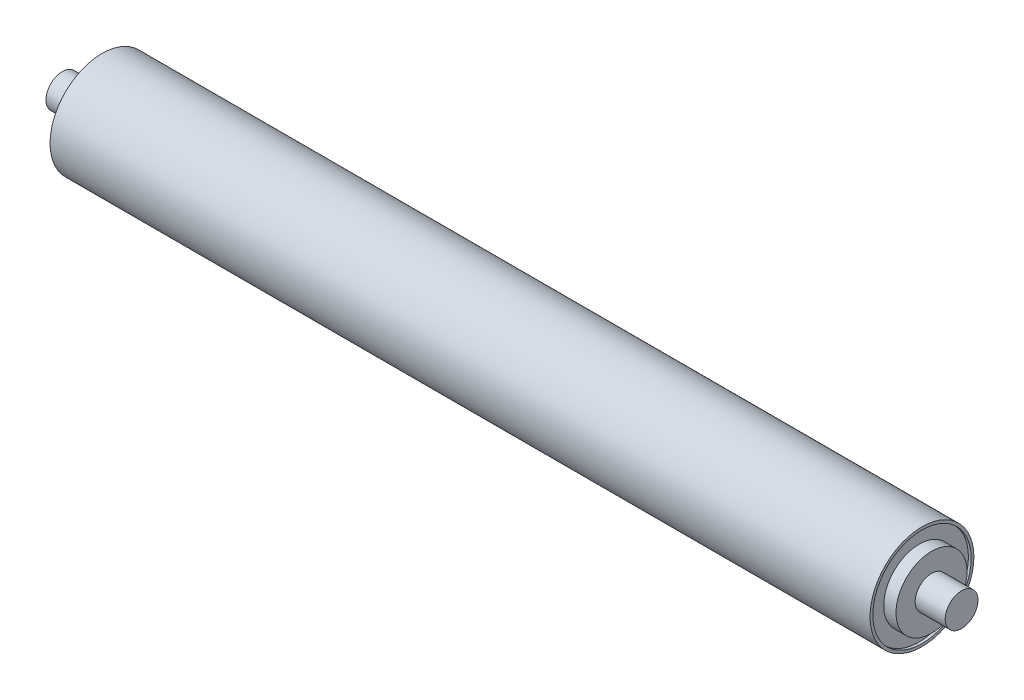
ISO-10303-21;
HEADER;
FILE_DESCRIPTION(('STEP AP214'),'2;1');
FILE_NAME('part.step','',(''),(''),'','','');
FILE_SCHEMA(('AUTOMOTIVE_DESIGN { 1 0 10303 214 1 1 1 1 }'));
ENDSEC;
DATA;
#1=APPLICATION_CONTEXT('core data for automotive mechanical design processes');
#2=APPLICATION_PROTOCOL_DEFINITION('international standard','automotive_design',2000,#1);
#3=PRODUCT_CONTEXT('',#1,'mechanical');
#4=PRODUCT('Part','Part','',(#3));
#5=PRODUCT_RELATED_PRODUCT_CATEGORY('part','',(#4));
#6=PRODUCT_DEFINITION_FORMATION('','',#4);
#7=PRODUCT_DEFINITION_CONTEXT('part definition',#1,'design');
#8=PRODUCT_DEFINITION('design','',#6,#7);
#9=PRODUCT_DEFINITION_SHAPE('','',#8);
#10=(LENGTH_UNIT() NAMED_UNIT(*) SI_UNIT(.MILLI.,.METRE.));
#11=(NAMED_UNIT(*) PLANE_ANGLE_UNIT() SI_UNIT($,.RADIAN.));
#12=(NAMED_UNIT(*) SI_UNIT($,.STERADIAN.) SOLID_ANGLE_UNIT());
#13=UNCERTAINTY_MEASURE_WITH_UNIT(LENGTH_MEASURE(1.E-05),#10,'distance_accuracy_value','');
#14=(GEOMETRIC_REPRESENTATION_CONTEXT(3) GLOBAL_UNCERTAINTY_ASSIGNED_CONTEXT((#13)) GLOBAL_UNIT_ASSIGNED_CONTEXT((#10,
#11,#12)) REPRESENTATION_CONTEXT('',''));
#15=CARTESIAN_POINT('',(0.,0.,0.));
#16=DIRECTION('',(0.,0.,1.));
#17=DIRECTION('',(1.,0.,0.));
#18=AXIS2_PLACEMENT_3D('',#15,#16,#17);
#19=CARTESIAN_POINT('',(0.,0.,0.));
#20=DIRECTION('',(-1.,0.,0.));
#21=DIRECTION('',(0.,0.,1.));
#22=AXIS2_PLACEMENT_3D('',#19,#20,#21);
#23=PLANE('',#22);
#24=CARTESIAN_POINT('',(0.,0.,0.));
#25=DIRECTION('',(1.,0.,0.));
#26=DIRECTION('',(0.,0.,-1.));
#27=AXIS2_PLACEMENT_3D('',#24,#25,#26);
#28=CIRCLE('',#27,6.);
#29=CARTESIAN_POINT('',(0.,0.,-6.));
#30=VERTEX_POINT('',#29);
#31=EDGE_CURVE('E10',#30,#30,#28,.T.);
#32=ORIENTED_EDGE('',*,*,#31,.F.);
#33=EDGE_LOOP('',(#32));
#34=FACE_BOUND('',#33,.T.);
#35=ADVANCED_FACE('F33',(#34),#23,.T.);
#36=CARTESIAN_POINT('',(329.,0.,0.));
#37=DIRECTION('',(1.,0.,0.));
#38=DIRECTION('',(0.,0.,-1.));
#39=AXIS2_PLACEMENT_3D('',#36,#37,#38);
#40=CYLINDRICAL_SURFACE('',#39,6.);
#41=ORIENTED_EDGE('',*,*,#31,.T.);
#42=EDGE_LOOP('',(#41));
#43=FACE_BOUND('',#42,.T.);
#44=CARTESIAN_POINT('',(11.,0.,0.));
#45=DIRECTION('',(1.,0.,0.));
#46=DIRECTION('',(0.,0.,-1.));
#47=AXIS2_PLACEMENT_3D('',#44,#45,#46);
#48=CIRCLE('',#47,6.);
#49=CARTESIAN_POINT('',(11.,0.,-6.));
#50=VERTEX_POINT('',#49);
#51=EDGE_CURVE('E39',#50,#50,#48,.T.);
#52=ORIENTED_EDGE('',*,*,#51,.F.);
#53=EDGE_LOOP('',(#52));
#54=FACE_BOUND('',#53,.T.);
#55=ADVANCED_FACE('F99',(#43,#54),#40,.T.);
#56=CARTESIAN_POINT('',(11.,6.,0.));
#57=DIRECTION('',(-1.,0.,0.));
#58=DIRECTION('',(0.,0.,1.));
#59=AXIS2_PLACEMENT_3D('',#56,#57,#58);
#60=PLANE('',#59);
#61=ORIENTED_EDGE('',*,*,#51,.T.);
#62=EDGE_LOOP('',(#61));
#63=FACE_BOUND('',#62,.T.);
#64=CARTESIAN_POINT('',(11.,0.,0.));
#65=DIRECTION('',(1.,0.,0.));
#66=DIRECTION('',(0.,0.,-1.));
#67=AXIS2_PLACEMENT_3D('',#64,#65,#66);
#68=CIRCLE('',#67,13.);
#69=CARTESIAN_POINT('',(11.,0.,-13.));
#70=VERTEX_POINT('',#69);
#71=EDGE_CURVE('E43',#70,#70,#68,.T.);
#72=ORIENTED_EDGE('',*,*,#71,.F.);
#73=EDGE_LOOP('',(#72));
#74=FACE_BOUND('',#73,.T.);
#75=ADVANCED_FACE('F104',(#63,#74),#60,.T.);
#76=CARTESIAN_POINT('',(329.,0.,0.));
#77=DIRECTION('',(1.,0.,0.));
#78=DIRECTION('',(0.,0.,-1.));
#79=AXIS2_PLACEMENT_3D('',#76,#77,#78);
#80=CYLINDRICAL_SURFACE('',#79,13.);
#81=ORIENTED_EDGE('',*,*,#71,.T.);
#82=EDGE_LOOP('',(#81));
#83=FACE_BOUND('',#82,.T.);
#84=CARTESIAN_POINT('',(15.5,0.,0.));
#85=DIRECTION('',(1.,0.,0.));
#86=DIRECTION('',(0.,0.,-1.));
#87=AXIS2_PLACEMENT_3D('',#84,#85,#86);
#88=CIRCLE('',#87,13.);
#89=CARTESIAN_POINT('',(15.5,0.,-13.));
#90=VERTEX_POINT('',#89);
#91=EDGE_CURVE('E47',#90,#90,#88,.T.);
#92=ORIENTED_EDGE('',*,*,#91,.F.);
#93=EDGE_LOOP('',(#92));
#94=FACE_BOUND('',#93,.T.);
#95=ADVANCED_FACE('F108',(#83,#94),#80,.T.);
#96=CARTESIAN_POINT('',(15.5,13.,0.));
#97=DIRECTION('',(-1.,0.,0.));
#98=DIRECTION('',(0.,0.,1.));
#99=AXIS2_PLACEMENT_3D('',#96,#97,#98);
#100=PLANE('',#99);
#101=ORIENTED_EDGE('',*,*,#91,.T.);
#102=EDGE_LOOP('',(#101));
#103=FACE_BOUND('',#102,.T.);
#104=CARTESIAN_POINT('',(15.5,0.,0.));
#105=DIRECTION('',(1.,0.,0.));
#106=DIRECTION('',(0.,0.,-1.));
#107=AXIS2_PLACEMENT_3D('',#104,#105,#106);
#108=CIRCLE('',#107,18.);
#109=CARTESIAN_POINT('',(15.5,0.,-18.));
#110=VERTEX_POINT('',#109);
#111=EDGE_CURVE('E52',#110,#110,#108,.T.);
#112=ORIENTED_EDGE('',*,*,#111,.F.);
#113=EDGE_LOOP('',(#112));
#114=FACE_BOUND('',#113,.T.);
#115=ADVANCED_FACE('F114',(#103,#114),#100,.T.);
#116=CARTESIAN_POINT('',(329.,0.,0.));
#117=DIRECTION('',(1.,0.,0.));
#118=DIRECTION('',(0.,0.,-1.));
#119=AXIS2_PLACEMENT_3D('',#116,#117,#118);
#120=CYLINDRICAL_SURFACE('',#119,18.);
#121=ORIENTED_EDGE('',*,*,#111,.T.);
#122=EDGE_LOOP('',(#121));
#123=FACE_BOUND('',#122,.T.);
#124=CARTESIAN_POINT('',(14.5,0.,0.));
#125=DIRECTION('',(1.,0.,0.));
#126=DIRECTION('',(0.,0.,-1.));
#127=AXIS2_PLACEMENT_3D('',#124,#125,#126);
#128=CIRCLE('',#127,18.);
#129=CARTESIAN_POINT('',(14.5,0.,-18.));
#130=VERTEX_POINT('',#129);
#131=EDGE_CURVE('E55',#130,#130,#128,.T.);
#132=ORIENTED_EDGE('',*,*,#131,.F.);
#133=EDGE_LOOP('',(#132));
#134=FACE_BOUND('',#133,.T.);
#135=ADVANCED_FACE('F118',(#123,#134),#120,.F.);
#136=CARTESIAN_POINT('',(14.5,18.,0.));
#137=DIRECTION('',(-1.,0.,0.));
#138=DIRECTION('',(0.,0.,1.));
#139=AXIS2_PLACEMENT_3D('',#136,#137,#138);
#140=PLANE('',#139);
#141=ORIENTED_EDGE('',*,*,#131,.T.);
#142=EDGE_LOOP('',(#141));
#143=FACE_BOUND('',#142,.T.);
#144=CARTESIAN_POINT('',(14.5,0.,0.));
#145=DIRECTION('',(1.,0.,0.));
#146=DIRECTION('',(0.,0.,-1.));
#147=AXIS2_PLACEMENT_3D('',#144,#145,#146);
#148=CIRCLE('',#147,19.);
#149=CARTESIAN_POINT('',(14.5,0.,-19.));
#150=VERTEX_POINT('',#149);
#151=EDGE_CURVE('E58',#150,#150,#148,.T.);
#152=ORIENTED_EDGE('',*,*,#151,.F.);
#153=EDGE_LOOP('',(#152));
#154=FACE_BOUND('',#153,.T.);
#155=ADVANCED_FACE('F122',(#143,#154),#140,.T.);
#156=CARTESIAN_POINT('',(329.,0.,0.));
#157=DIRECTION('',(1.,0.,0.));
#158=DIRECTION('',(0.,0.,-1.));
#159=AXIS2_PLACEMENT_3D('',#156,#157,#158);
#160=CYLINDRICAL_SURFACE('',#159,19.);
#161=ORIENTED_EDGE('',*,*,#151,.T.);
#162=EDGE_LOOP('',(#161));
#163=FACE_BOUND('',#162,.T.);
#164=CARTESIAN_POINT('',(314.5,0.,0.));
#165=DIRECTION('',(1.,0.,0.));
#166=DIRECTION('',(0.,0.,-1.));
#167=AXIS2_PLACEMENT_3D('',#164,#165,#166);
#168=CIRCLE('',#167,19.);
#169=CARTESIAN_POINT('',(314.5,0.,-19.));
#170=VERTEX_POINT('',#169);
#171=EDGE_CURVE('E61',#170,#170,#168,.T.);
#172=ORIENTED_EDGE('',*,*,#171,.F.);
#173=EDGE_LOOP('',(#172));
#174=FACE_BOUND('',#173,.T.);
#175=ADVANCED_FACE('F126',(#163,#174),#160,.T.);
#176=CARTESIAN_POINT('',(314.5,18.,0.));
#177=DIRECTION('',(1.,0.,0.));
#178=DIRECTION('',(0.,0.,-1.));
#179=AXIS2_PLACEMENT_3D('',#176,#177,#178);
#180=PLANE('',#179);
#181=ORIENTED_EDGE('',*,*,#171,.T.);
#182=EDGE_LOOP('',(#181));
#183=FACE_BOUND('',#182,.T.);
#184=CARTESIAN_POINT('',(314.5,0.,0.));
#185=DIRECTION('',(1.,0.,0.));
#186=DIRECTION('',(0.,0.,-1.));
#187=AXIS2_PLACEMENT_3D('',#184,#185,#186);
#188=CIRCLE('',#187,18.);
#189=CARTESIAN_POINT('',(314.5,0.,-18.));
#190=VERTEX_POINT('',#189);
#191=EDGE_CURVE('E64',#190,#190,#188,.T.);
#192=ORIENTED_EDGE('',*,*,#191,.F.);
#193=EDGE_LOOP('',(#192));
#194=FACE_BOUND('',#193,.T.);
#195=ADVANCED_FACE('F130',(#183,#194),#180,.T.);
#196=CARTESIAN_POINT('',(329.,0.,0.));
#197=DIRECTION('',(1.,0.,0.));
#198=DIRECTION('',(0.,0.,-1.));
#199=AXIS2_PLACEMENT_3D('',#196,#197,#198);
#200=CYLINDRICAL_SURFACE('',#199,18.);
#201=ORIENTED_EDGE('',*,*,#191,.T.);
#202=EDGE_LOOP('',(#201));
#203=FACE_BOUND('',#202,.T.);
#204=CARTESIAN_POINT('',(313.5,0.,0.));
#205=DIRECTION('',(1.,0.,0.));
#206=DIRECTION('',(0.,0.,-1.));
#207=AXIS2_PLACEMENT_3D('',#204,#205,#206);
#208=CIRCLE('',#207,18.);
#209=CARTESIAN_POINT('',(313.5,0.,-18.));
#210=VERTEX_POINT('',#209);
#211=EDGE_CURVE('E67',#210,#210,#208,.T.);
#212=ORIENTED_EDGE('',*,*,#211,.F.);
#213=EDGE_LOOP('',(#212));
#214=FACE_BOUND('',#213,.T.);
#215=ADVANCED_FACE('F134',(#203,#214),#200,.F.);
#216=CARTESIAN_POINT('',(313.5,13.,0.));
#217=DIRECTION('',(1.,0.,0.));
#218=DIRECTION('',(0.,0.,-1.));
#219=AXIS2_PLACEMENT_3D('',#216,#217,#218);
#220=PLANE('',#219);
#221=ORIENTED_EDGE('',*,*,#211,.T.);
#222=EDGE_LOOP('',(#221));
#223=FACE_BOUND('',#222,.T.);
#224=CARTESIAN_POINT('',(313.5,0.,0.));
#225=DIRECTION('',(1.,0.,0.));
#226=DIRECTION('',(0.,0.,-1.));
#227=AXIS2_PLACEMENT_3D('',#224,#225,#226);
#228=CIRCLE('',#227,13.);
#229=CARTESIAN_POINT('',(313.5,0.,-13.));
#230=VERTEX_POINT('',#229);
#231=EDGE_CURVE('E70',#230,#230,#228,.T.);
#232=ORIENTED_EDGE('',*,*,#231,.F.);
#233=EDGE_LOOP('',(#232));
#234=FACE_BOUND('',#233,.T.);
#235=ADVANCED_FACE('F138',(#223,#234),#220,.T.);
#236=CARTESIAN_POINT('',(329.,0.,0.));
#237=DIRECTION('',(1.,0.,0.));
#238=DIRECTION('',(0.,0.,-1.));
#239=AXIS2_PLACEMENT_3D('',#236,#237,#238);
#240=CYLINDRICAL_SURFACE('',#239,13.);
#241=ORIENTED_EDGE('',*,*,#231,.T.);
#242=EDGE_LOOP('',(#241));
#243=FACE_BOUND('',#242,.T.);
#244=CARTESIAN_POINT('',(318.,0.,0.));
#245=DIRECTION('',(1.,0.,0.));
#246=DIRECTION('',(0.,0.,-1.));
#247=AXIS2_PLACEMENT_3D('',#244,#245,#246);
#248=CIRCLE('',#247,13.);
#249=CARTESIAN_POINT('',(318.,0.,-13.));
#250=VERTEX_POINT('',#249);
#251=EDGE_CURVE('E73',#250,#250,#248,.T.);
#252=ORIENTED_EDGE('',*,*,#251,.F.);
#253=EDGE_LOOP('',(#252));
#254=FACE_BOUND('',#253,.T.);
#255=ADVANCED_FACE('F95',(#243,#254),#240,.T.);
#256=CARTESIAN_POINT('',(318.,6.,0.));
#257=DIRECTION('',(1.,0.,0.));
#258=DIRECTION('',(0.,0.,-1.));
#259=AXIS2_PLACEMENT_3D('',#256,#257,#258);
#260=PLANE('',#259);
#261=ORIENTED_EDGE('',*,*,#251,.T.);
#262=EDGE_LOOP('',(#261));
#263=FACE_BOUND('',#262,.T.);
#264=CARTESIAN_POINT('',(318.,0.,0.));
#265=DIRECTION('',(1.,0.,0.));
#266=DIRECTION('',(0.,0.,-1.));
#267=AXIS2_PLACEMENT_3D('',#264,#265,#266);
#268=CIRCLE('',#267,6.);
#269=CARTESIAN_POINT('',(318.,0.,-6.));
#270=VERTEX_POINT('',#269);
#271=EDGE_CURVE('E76',#270,#270,#268,.T.);
#272=ORIENTED_EDGE('',*,*,#271,.F.);
#273=EDGE_LOOP('',(#272));
#274=FACE_BOUND('',#273,.T.);
#275=ADVANCED_FACE('F87',(#263,#274),#260,.T.);
#276=CARTESIAN_POINT('',(329.,0.,0.));
#277=DIRECTION('',(1.,0.,0.));
#278=DIRECTION('',(0.,0.,-1.));
#279=AXIS2_PLACEMENT_3D('',#276,#277,#278);
#280=CYLINDRICAL_SURFACE('',#279,6.);
#281=ORIENTED_EDGE('',*,*,#271,.T.);
#282=EDGE_LOOP('',(#281));
#283=FACE_BOUND('',#282,.T.);
#284=CARTESIAN_POINT('',(329.,0.,0.));
#285=DIRECTION('',(1.,0.,0.));
#286=DIRECTION('',(0.,0.,-1.));
#287=AXIS2_PLACEMENT_3D('',#284,#285,#286);
#288=CIRCLE('',#287,6.);
#289=CARTESIAN_POINT('',(329.,0.,-6.));
#290=VERTEX_POINT('',#289);
#291=EDGE_CURVE('E79',#290,#290,#288,.T.);
#292=ORIENTED_EDGE('',*,*,#291,.F.);
#293=EDGE_LOOP('',(#292));
#294=FACE_BOUND('',#293,.T.);
#295=ADVANCED_FACE('F85',(#283,#294),#280,.T.);
#296=CARTESIAN_POINT('',(329.,0.,0.));
#297=DIRECTION('',(1.,0.,0.));
#298=DIRECTION('',(0.,0.,-1.));
#299=AXIS2_PLACEMENT_3D('',#296,#297,#298);
#300=PLANE('',#299);
#301=ORIENTED_EDGE('',*,*,#291,.T.);
#302=EDGE_LOOP('',(#301));
#303=FACE_BOUND('',#302,.T.);
#304=ADVANCED_FACE('F83',(#303),#300,.T.);
#305=CLOSED_SHELL('',(#35,#55,#75,#95,#115,#135,#155,#175,#195,#215,#235,#255,#275,#295,#304));
#306=MANIFOLD_SOLID_BREP('B2',#305);
#307=ADVANCED_BREP_SHAPE_REPRESENTATION('',(#18,#306),#14);
#308=SHAPE_DEFINITION_REPRESENTATION(#9,#307);
ENDSEC;
END-ISO-10303-21;
